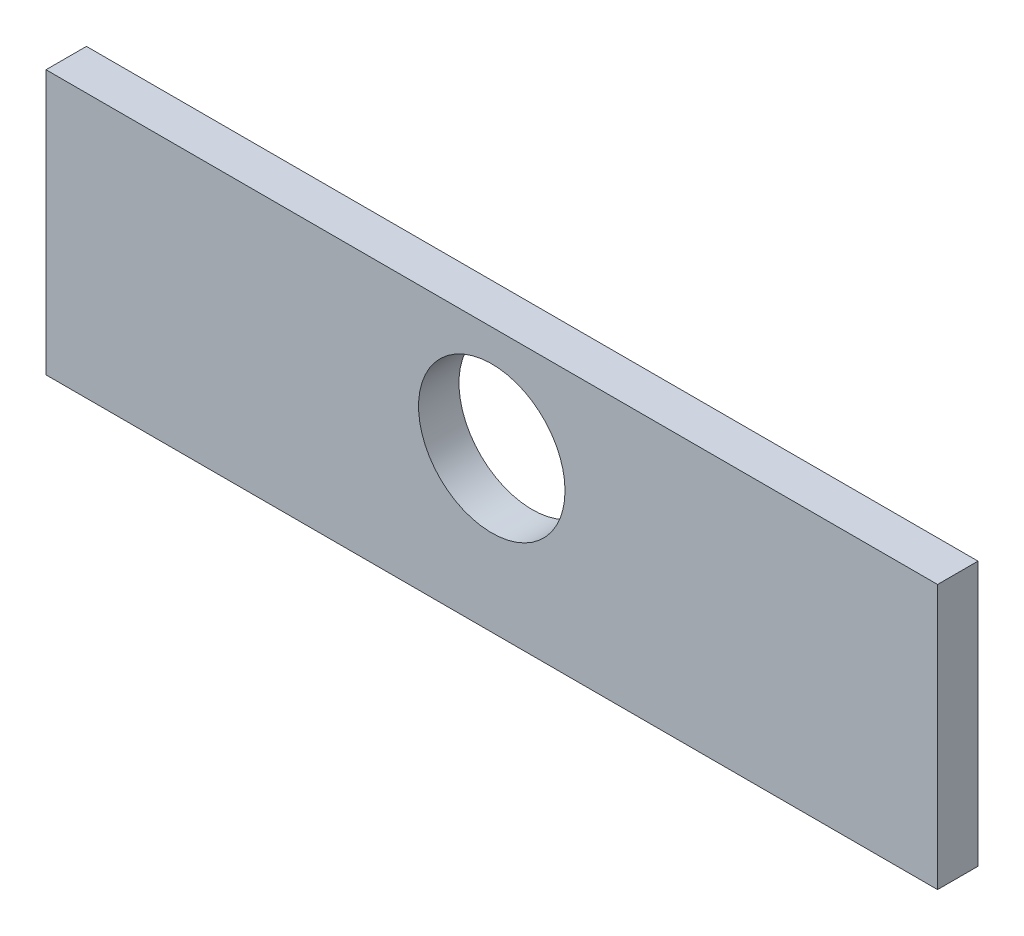
ISO-10303-21;
HEADER;
FILE_DESCRIPTION(('STEP AP214'),'2;1');
FILE_NAME('part.step','',(''),(''),'','','');
FILE_SCHEMA(('AUTOMOTIVE_DESIGN { 1 0 10303 214 1 1 1 1 }'));
ENDSEC;
DATA;
#1=APPLICATION_CONTEXT('core data for automotive mechanical design processes');
#2=APPLICATION_PROTOCOL_DEFINITION('international standard','automotive_design',2000,#1);
#3=PRODUCT_CONTEXT('',#1,'mechanical');
#4=PRODUCT('Part','Part','',(#3));
#5=PRODUCT_RELATED_PRODUCT_CATEGORY('part','',(#4));
#6=PRODUCT_DEFINITION_FORMATION('','',#4);
#7=PRODUCT_DEFINITION_CONTEXT('part definition',#1,'design');
#8=PRODUCT_DEFINITION('design','',#6,#7);
#9=PRODUCT_DEFINITION_SHAPE('','',#8);
#10=(LENGTH_UNIT() NAMED_UNIT(*) SI_UNIT(.MILLI.,.METRE.));
#11=(NAMED_UNIT(*) PLANE_ANGLE_UNIT() SI_UNIT($,.RADIAN.));
#12=(NAMED_UNIT(*) SI_UNIT($,.STERADIAN.) SOLID_ANGLE_UNIT());
#13=UNCERTAINTY_MEASURE_WITH_UNIT(LENGTH_MEASURE(1.E-05),#10,'distance_accuracy_value','');
#14=(GEOMETRIC_REPRESENTATION_CONTEXT(3) GLOBAL_UNCERTAINTY_ASSIGNED_CONTEXT((#13)) GLOBAL_UNIT_ASSIGNED_CONTEXT((#10,
#11,#12)) REPRESENTATION_CONTEXT('',''));
#15=CARTESIAN_POINT('',(0.,0.,0.));
#16=DIRECTION('',(0.,0.,1.));
#17=DIRECTION('',(1.,0.,0.));
#18=AXIS2_PLACEMENT_3D('',#15,#16,#17);
#19=CARTESIAN_POINT('',(70.,20.75,6.35));
#20=DIRECTION('',(-1.,0.,0.));
#21=DIRECTION('',(0.,0.,1.));
#22=AXIS2_PLACEMENT_3D('',#19,#20,#21);
#23=PLANE('',#22);
#24=DIRECTION('',(0.,1.,0.));
#25=VECTOR('',#24,1.);
#26=CARTESIAN_POINT('',(70.,20.75,0.));
#27=LINE('',#26,#25);
#28=CARTESIAN_POINT('',(70.,-20.75,0.));
#29=VERTEX_POINT('',#28);
#30=CARTESIAN_POINT('',(70.,20.75,0.));
#31=VERTEX_POINT('',#30);
#32=EDGE_CURVE('E95',#29,#31,#27,.T.);
#33=ORIENTED_EDGE('',*,*,#32,.T.);
#34=DIRECTION('',(0.,0.,-1.));
#35=VECTOR('',#34,1.);
#36=CARTESIAN_POINT('',(70.,20.75,6.35));
#37=LINE('',#36,#35);
#38=CARTESIAN_POINT('',(70.,20.75,6.35));
#39=VERTEX_POINT('',#38);
#40=EDGE_CURVE('E11',#39,#31,#37,.T.);
#41=ORIENTED_EDGE('',*,*,#40,.F.);
#42=DIRECTION('',(0.,1.,0.));
#43=VECTOR('',#42,1.);
#44=CARTESIAN_POINT('',(70.,20.75,6.35));
#45=LINE('',#44,#43);
#46=CARTESIAN_POINT('',(70.,-20.75,6.35));
#47=VERTEX_POINT('',#46);
#48=EDGE_CURVE('E83',#47,#39,#45,.T.);
#49=ORIENTED_EDGE('',*,*,#48,.F.);
#50=DIRECTION('',(0.,0.,-1.));
#51=VECTOR('',#50,1.);
#52=CARTESIAN_POINT('',(70.,-20.75,6.35));
#53=LINE('',#52,#51);
#54=EDGE_CURVE('E91',#47,#29,#53,.T.);
#55=ORIENTED_EDGE('',*,*,#54,.T.);
#56=EDGE_LOOP('',(#33,#41,#49,#55));
#57=FACE_BOUND('',#56,.T.);
#58=ADVANCED_FACE('F32',(#57),#23,.F.);
#59=CARTESIAN_POINT('',(-70.,20.75,6.35));
#60=DIRECTION('',(0.,-1.,0.));
#61=DIRECTION('',(0.,0.,-1.));
#62=AXIS2_PLACEMENT_3D('',#59,#60,#61);
#63=PLANE('',#62);
#64=DIRECTION('',(-1.,0.,0.));
#65=VECTOR('',#64,1.);
#66=CARTESIAN_POINT('',(-70.,20.75,0.));
#67=LINE('',#66,#65);
#68=CARTESIAN_POINT('',(-70.,20.75,0.));
#69=VERTEX_POINT('',#68);
#70=EDGE_CURVE('E87',#31,#69,#67,.T.);
#71=ORIENTED_EDGE('',*,*,#70,.T.);
#72=DIRECTION('',(0.,0.,-1.));
#73=VECTOR('',#72,1.);
#74=CARTESIAN_POINT('',(-70.,20.75,6.35));
#75=LINE('',#74,#73);
#76=CARTESIAN_POINT('',(-70.,20.75,6.35));
#77=VERTEX_POINT('',#76);
#78=EDGE_CURVE('E40',#77,#69,#75,.T.);
#79=ORIENTED_EDGE('',*,*,#78,.F.);
#80=DIRECTION('',(-1.,0.,0.));
#81=VECTOR('',#80,1.);
#82=CARTESIAN_POINT('',(-70.,20.75,6.35));
#83=LINE('',#82,#81);
#84=EDGE_CURVE('E78',#39,#77,#83,.T.);
#85=ORIENTED_EDGE('',*,*,#84,.F.);
#86=ORIENTED_EDGE('',*,*,#40,.T.);
#87=EDGE_LOOP('',(#71,#79,#85,#86));
#88=FACE_BOUND('',#87,.T.);
#89=ADVANCED_FACE('F86',(#88),#63,.F.);
#90=CARTESIAN_POINT('',(-70.,20.75,6.35));
#91=DIRECTION('',(1.,0.,0.));
#92=DIRECTION('',(0.,0.,-1.));
#93=AXIS2_PLACEMENT_3D('',#90,#91,#92);
#94=PLANE('',#93);
#95=DIRECTION('',(0.,-1.,0.));
#96=VECTOR('',#95,1.);
#97=CARTESIAN_POINT('',(-70.,20.75,0.));
#98=LINE('',#97,#96);
#99=CARTESIAN_POINT('',(-70.,-20.75,0.));
#100=VERTEX_POINT('',#99);
#101=EDGE_CURVE('E65',#69,#100,#98,.T.);
#102=ORIENTED_EDGE('',*,*,#101,.T.);
#103=DIRECTION('',(0.,0.,-1.));
#104=VECTOR('',#103,1.);
#105=CARTESIAN_POINT('',(-70.,-20.75,6.35));
#106=LINE('',#105,#104);
#107=CARTESIAN_POINT('',(-70.,-20.75,6.35));
#108=VERTEX_POINT('',#107);
#109=EDGE_CURVE('E88',#108,#100,#106,.T.);
#110=ORIENTED_EDGE('',*,*,#109,.F.);
#111=DIRECTION('',(0.,-1.,0.));
#112=VECTOR('',#111,1.);
#113=CARTESIAN_POINT('',(-70.,20.75,6.35));
#114=LINE('',#113,#112);
#115=EDGE_CURVE('E81',#77,#108,#114,.T.);
#116=ORIENTED_EDGE('',*,*,#115,.F.);
#117=ORIENTED_EDGE('',*,*,#78,.T.);
#118=EDGE_LOOP('',(#102,#110,#116,#117));
#119=FACE_BOUND('',#118,.T.);
#120=ADVANCED_FACE('F89',(#119),#94,.F.);
#121=CARTESIAN_POINT('',(-70.,-20.75,6.35));
#122=DIRECTION('',(0.,1.,0.));
#123=DIRECTION('',(0.,0.,1.));
#124=AXIS2_PLACEMENT_3D('',#121,#122,#123);
#125=PLANE('',#124);
#126=DIRECTION('',(1.,0.,0.));
#127=VECTOR('',#126,1.);
#128=CARTESIAN_POINT('',(-70.,-20.75,0.));
#129=LINE('',#128,#127);
#130=EDGE_CURVE('E71',#100,#29,#129,.T.);
#131=ORIENTED_EDGE('',*,*,#130,.T.);
#132=ORIENTED_EDGE('',*,*,#54,.F.);
#133=DIRECTION('',(1.,0.,0.));
#134=VECTOR('',#133,1.);
#135=CARTESIAN_POINT('',(-70.,-20.75,6.35));
#136=LINE('',#135,#134);
#137=EDGE_CURVE('E48',#108,#47,#136,.T.);
#138=ORIENTED_EDGE('',*,*,#137,.F.);
#139=ORIENTED_EDGE('',*,*,#109,.T.);
#140=EDGE_LOOP('',(#131,#132,#138,#139));
#141=FACE_BOUND('',#140,.T.);
#142=ADVANCED_FACE('F103',(#141),#125,.F.);
#143=CARTESIAN_POINT('',(0.,0.,6.35));
#144=DIRECTION('',(0.,0.,1.));
#145=DIRECTION('',(1.,0.,0.));
#146=AXIS2_PLACEMENT_3D('',#143,#144,#145);
#147=PLANE('',#146);
#148=CARTESIAN_POINT('',(0.,4.25,6.35));
#149=DIRECTION('',(0.,0.,1.));
#150=DIRECTION('',(1.,0.,0.));
#151=AXIS2_PLACEMENT_3D('',#148,#149,#150);
#152=CIRCLE('',#151,11.5);
#153=CARTESIAN_POINT('',(11.5,4.25,6.35));
#154=VERTEX_POINT('',#153);
#155=EDGE_CURVE('E109',#154,#154,#152,.T.);
#156=ORIENTED_EDGE('',*,*,#155,.F.);
#157=EDGE_LOOP('',(#156));
#158=FACE_BOUND('',#157,.T.);
#159=ORIENTED_EDGE('',*,*,#48,.T.);
#160=ORIENTED_EDGE('',*,*,#84,.T.);
#161=ORIENTED_EDGE('',*,*,#115,.T.);
#162=ORIENTED_EDGE('',*,*,#137,.T.);
#163=EDGE_LOOP('',(#159,#160,#161,#162));
#164=FACE_BOUND('',#163,.T.);
#165=ADVANCED_FACE('F79',(#158,#164),#147,.T.);
#166=CARTESIAN_POINT('',(0.,0.,0.));
#167=DIRECTION('',(0.,0.,1.));
#168=DIRECTION('',(1.,0.,0.));
#169=AXIS2_PLACEMENT_3D('',#166,#167,#168);
#170=PLANE('',#169);
#171=CARTESIAN_POINT('',(0.,4.25,0.));
#172=DIRECTION('',(0.,0.,1.));
#173=DIRECTION('',(1.,0.,0.));
#174=AXIS2_PLACEMENT_3D('',#171,#172,#173);
#175=CIRCLE('',#174,11.5);
#176=CARTESIAN_POINT('',(11.5,4.25,0.));
#177=VERTEX_POINT('',#176);
#178=EDGE_CURVE('E98',#177,#177,#175,.T.);
#179=ORIENTED_EDGE('',*,*,#178,.T.);
#180=EDGE_LOOP('',(#179));
#181=FACE_BOUND('',#180,.T.);
#182=ORIENTED_EDGE('',*,*,#32,.F.);
#183=ORIENTED_EDGE('',*,*,#130,.F.);
#184=ORIENTED_EDGE('',*,*,#101,.F.);
#185=ORIENTED_EDGE('',*,*,#70,.F.);
#186=EDGE_LOOP('',(#182,#183,#184,#185));
#187=FACE_BOUND('',#186,.T.);
#188=ADVANCED_FACE('F106',(#181,#187),#170,.F.);
#189=CARTESIAN_POINT('',(0.,4.25,0.));
#190=DIRECTION('',(0.,0.,1.));
#191=DIRECTION('',(1.,0.,0.));
#192=AXIS2_PLACEMENT_3D('',#189,#190,#191);
#193=CYLINDRICAL_SURFACE('',#192,11.5);
#194=ORIENTED_EDGE('',*,*,#178,.F.);
#195=EDGE_LOOP('',(#194));
#196=FACE_BOUND('',#195,.T.);
#197=ORIENTED_EDGE('',*,*,#155,.T.);
#198=EDGE_LOOP('',(#197));
#199=FACE_BOUND('',#198,.T.);
#200=ADVANCED_FACE('F116',(#196,#199),#193,.F.);
#201=CLOSED_SHELL('',(#58,#89,#120,#142,#165,#188,#200));
#202=MANIFOLD_SOLID_BREP('B2',#201);
#203=ADVANCED_BREP_SHAPE_REPRESENTATION('',(#18,#202),#14);
#204=SHAPE_DEFINITION_REPRESENTATION(#9,#203);
ENDSEC;
END-ISO-10303-21;
